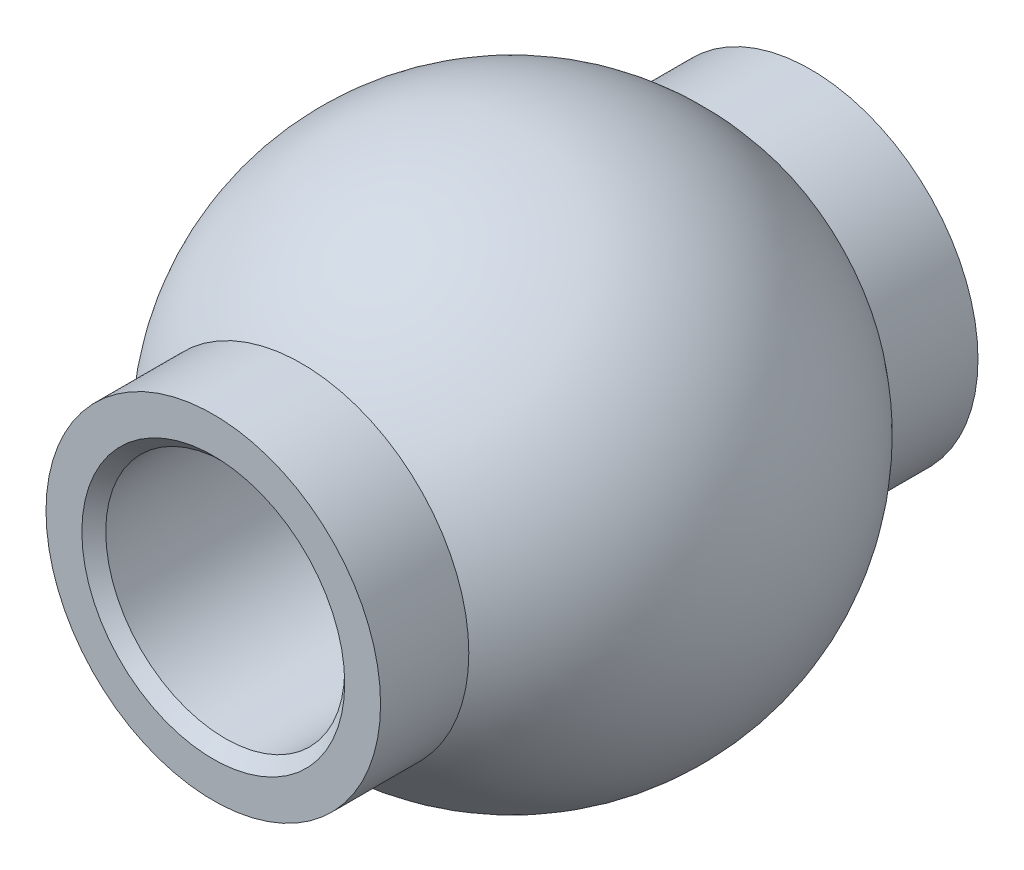
ISO-10303-21;
HEADER;
FILE_DESCRIPTION(('STEP AP214'),'2;1');
FILE_NAME('part.step','',(''),(''),'','','');
FILE_SCHEMA(('AUTOMOTIVE_DESIGN { 1 0 10303 214 1 1 1 1 }'));
ENDSEC;
DATA;
#1=APPLICATION_CONTEXT('core data for automotive mechanical design processes');
#2=APPLICATION_PROTOCOL_DEFINITION('international standard','automotive_design',2000,#1);
#3=PRODUCT_CONTEXT('',#1,'mechanical');
#4=PRODUCT('Part','Part','',(#3));
#5=PRODUCT_RELATED_PRODUCT_CATEGORY('part','',(#4));
#6=PRODUCT_DEFINITION_FORMATION('','',#4);
#7=PRODUCT_DEFINITION_CONTEXT('part definition',#1,'design');
#8=PRODUCT_DEFINITION('design','',#6,#7);
#9=PRODUCT_DEFINITION_SHAPE('','',#8);
#10=(LENGTH_UNIT() NAMED_UNIT(*) SI_UNIT(.MILLI.,.METRE.));
#11=(NAMED_UNIT(*) PLANE_ANGLE_UNIT() SI_UNIT($,.RADIAN.));
#12=(NAMED_UNIT(*) SI_UNIT($,.STERADIAN.) SOLID_ANGLE_UNIT());
#13=UNCERTAINTY_MEASURE_WITH_UNIT(LENGTH_MEASURE(1.E-05),#10,'distance_accuracy_value','');
#14=(GEOMETRIC_REPRESENTATION_CONTEXT(3) GLOBAL_UNCERTAINTY_ASSIGNED_CONTEXT((#13)) GLOBAL_UNIT_ASSIGNED_CONTEXT((#10,
#11,#12)) REPRESENTATION_CONTEXT('',''));
#15=CARTESIAN_POINT('',(0.,0.,0.));
#16=DIRECTION('',(0.,0.,1.));
#17=DIRECTION('',(1.,0.,0.));
#18=AXIS2_PLACEMENT_3D('',#15,#16,#17);
#19=CARTESIAN_POINT('',(0.,25.4,0.));
#20=DIRECTION('',(0.,-1.,0.));
#21=DIRECTION('',(-1.,0.,0.));
#22=AXIS2_PLACEMENT_3D('',#19,#20,#21);
#23=SPHERICAL_SURFACE('',#22,14.2875);
#24=CARTESIAN_POINT('',(0.,25.4,0.));
#25=DIRECTION('',(0.,0.,-1.));
#26=DIRECTION('',(-1.,0.,0.));
#27=AXIS2_PLACEMENT_3D('',#24,#25,#26);
#28=SPHERICAL_SURFACE('',#27,14.2875);
#29=CARTESIAN_POINT('',(0.,25.4,11.1848359956684));
#30=DIRECTION('',(0.,0.,-1.));
#31=DIRECTION('',(-1.,0.,0.));
#32=AXIS2_PLACEMENT_3D('',#29,#30,#31);
#33=CIRCLE('',#32,8.89);
#34=CARTESIAN_POINT('',(-8.89000000000001,25.4,11.1848359956684));
#35=VERTEX_POINT('',#34);
#36=EDGE_CURVE('E55',#35,#35,#33,.T.);
#37=ORIENTED_EDGE('',*,*,#36,.T.);
#38=EDGE_LOOP('',(#37));
#39=FACE_BOUND('',#38,.T.);
#40=CARTESIAN_POINT('',(0.,25.4,-11.1848359956684));
#41=DIRECTION('',(0.,0.,1.));
#42=DIRECTION('',(1.,0.,0.));
#43=AXIS2_PLACEMENT_3D('',#40,#41,#42);
#44=CIRCLE('',#43,8.89);
#45=CARTESIAN_POINT('',(8.88999999999999,25.4,-11.1848359956684));
#46=VERTEX_POINT('',#45);
#47=EDGE_CURVE('E52',#46,#46,#44,.T.);
#48=ORIENTED_EDGE('',*,*,#47,.T.);
#49=EDGE_LOOP('',(#48));
#50=FACE_BOUND('',#49,.T.);
#51=ADVANCED_FACE('F32',(#39,#50),#28,.T.);
#52=CARTESIAN_POINT('',(0.,25.4,15.875));
#53=DIRECTION('',(0.,0.,-1.));
#54=DIRECTION('',(-1.,0.,0.));
#55=AXIS2_PLACEMENT_3D('',#52,#53,#54);
#56=CYLINDRICAL_SURFACE('',#55,8.89);
#57=ORIENTED_EDGE('',*,*,#36,.F.);
#58=EDGE_LOOP('',(#57));
#59=FACE_BOUND('',#58,.T.);
#60=CARTESIAN_POINT('',(0.,25.4,15.875));
#61=DIRECTION('',(0.,0.,1.));
#62=DIRECTION('',(1.,0.,0.));
#63=AXIS2_PLACEMENT_3D('',#60,#61,#62);
#64=CIRCLE('',#63,8.89);
#65=CARTESIAN_POINT('',(8.88999999999999,25.4,15.875));
#66=VERTEX_POINT('',#65);
#67=EDGE_CURVE('E58',#66,#66,#64,.T.);
#68=ORIENTED_EDGE('',*,*,#67,.F.);
#69=EDGE_LOOP('',(#68));
#70=FACE_BOUND('',#69,.T.);
#71=ADVANCED_FACE('F67',(#59,#70),#56,.T.);
#72=CARTESIAN_POINT('',(0.,25.4,15.875));
#73=DIRECTION('',(0.,0.,1.));
#74=DIRECTION('',(1.,0.,0.));
#75=AXIS2_PLACEMENT_3D('',#72,#73,#74);
#76=PLANE('',#75);
#77=CARTESIAN_POINT('',(0.,25.4,15.875));
#78=DIRECTION('',(0.,0.,1.));
#79=DIRECTION('',(1.,0.,0.));
#80=AXIS2_PLACEMENT_3D('',#77,#78,#79);
#81=CIRCLE('',#80,6.98500000000003);
#82=CARTESIAN_POINT('',(6.98500000000002,25.4,15.875));
#83=VERTEX_POINT('',#82);
#84=EDGE_CURVE('E10',#83,#83,#81,.F.);
#85=ORIENTED_EDGE('',*,*,#84,.T.);
#86=EDGE_LOOP('',(#85));
#87=FACE_BOUND('',#86,.T.);
#88=ORIENTED_EDGE('',*,*,#67,.T.);
#89=EDGE_LOOP('',(#88));
#90=FACE_BOUND('',#89,.T.);
#91=ADVANCED_FACE('F65',(#87,#90),#76,.T.);
#92=ORIENTED_EDGE('',*,*,#47,.F.);
#93=EDGE_LOOP('',(#92));
#94=FACE_BOUND('',#93,.T.);
#95=CARTESIAN_POINT('',(0.,25.4,-15.875));
#96=DIRECTION('',(0.,0.,1.));
#97=DIRECTION('',(1.,0.,0.));
#98=AXIS2_PLACEMENT_3D('',#95,#96,#97);
#99=CIRCLE('',#98,8.89);
#100=CARTESIAN_POINT('',(8.88999999999999,25.4,-15.875));
#101=VERTEX_POINT('',#100);
#102=EDGE_CURVE('E59',#101,#101,#99,.T.);
#103=ORIENTED_EDGE('',*,*,#102,.T.);
#104=EDGE_LOOP('',(#103));
#105=FACE_BOUND('',#104,.T.);
#106=ADVANCED_FACE('F71',(#94,#105),#56,.T.);
#107=CARTESIAN_POINT('',(0.,25.4,-15.875));
#108=DIRECTION('',(0.,0.,1.));
#109=DIRECTION('',(1.,0.,0.));
#110=AXIS2_PLACEMENT_3D('',#107,#108,#109);
#111=PLANE('',#110);
#112=CARTESIAN_POINT('',(0.,25.4,-15.875));
#113=DIRECTION('',(0.,0.,1.));
#114=DIRECTION('',(1.,0.,0.));
#115=AXIS2_PLACEMENT_3D('',#112,#113,#114);
#116=CIRCLE('',#115,6.98499999999999);
#117=CARTESIAN_POINT('',(6.98499999999998,25.4,-15.875));
#118=VERTEX_POINT('',#117);
#119=EDGE_CURVE('E47',#118,#118,#116,.T.);
#120=ORIENTED_EDGE('',*,*,#119,.T.);
#121=EDGE_LOOP('',(#120));
#122=FACE_BOUND('',#121,.T.);
#123=ORIENTED_EDGE('',*,*,#102,.F.);
#124=EDGE_LOOP('',(#123));
#125=FACE_BOUND('',#124,.T.);
#126=ADVANCED_FACE('F83',(#122,#125),#111,.F.);
#127=CARTESIAN_POINT('',(0.,25.4,-14.2875));
#128=DIRECTION('',(0.,0.,1.));
#129=DIRECTION('',(1.,0.,0.));
#130=AXIS2_PLACEMENT_3D('',#127,#128,#129);
#131=CYLINDRICAL_SURFACE('',#130,6.35);
#132=CARTESIAN_POINT('',(0.,25.4,-15.24));
#133=DIRECTION('',(0.,0.,1.));
#134=DIRECTION('',(1.,0.,0.));
#135=AXIS2_PLACEMENT_3D('',#132,#133,#134);
#136=CIRCLE('',#135,6.35);
#137=CARTESIAN_POINT('',(6.34999999999999,25.4,-15.24));
#138=VERTEX_POINT('',#137);
#139=EDGE_CURVE('E39',#138,#138,#136,.F.);
#140=CARTESIAN_POINT('',(0.,25.4,15.24));
#141=DIRECTION('',(0.,0.,1.));
#142=DIRECTION('',(1.,0.,0.));
#143=AXIS2_PLACEMENT_3D('',#140,#141,#142);
#144=CIRCLE('',#143,6.35);
#145=CARTESIAN_POINT('',(6.34999999999999,25.4,15.24));
#146=VERTEX_POINT('',#145);
#147=EDGE_CURVE('E43',#146,#146,#144,.T.);
#148=CARTESIAN_POINT('',(6.34999999999999,25.4,-15.24));
#149=CARTESIAN_POINT('',(6.34999999999999,25.4,-14.9225));
#150=CARTESIAN_POINT('',(6.34999999999999,25.4,-14.605));
#151=CARTESIAN_POINT('',(6.34999999999999,25.4,-13.97));
#152=CARTESIAN_POINT('',(6.34999999999999,25.4,-13.6525));
#153=CARTESIAN_POINT('',(6.34999999999999,25.4,-13.0175));
#154=CARTESIAN_POINT('',(6.34999999999999,25.4,-12.7));
#155=CARTESIAN_POINT('',(6.34999999999999,25.4,-12.065));
#156=CARTESIAN_POINT('',(6.34999999999999,25.4,-11.7475));
#157=CARTESIAN_POINT('',(6.34999999999999,25.4,-11.1125));
#158=CARTESIAN_POINT('',(6.34999999999999,25.4,-10.795));
#159=CARTESIAN_POINT('',(6.34999999999999,25.4,-10.16));
#160=CARTESIAN_POINT('',(6.34999999999999,25.4,-9.84250000000002));
#161=CARTESIAN_POINT('',(6.34999999999999,25.4,-9.20750000000002));
#162=CARTESIAN_POINT('',(6.34999999999999,25.4,-8.89000000000002));
#163=CARTESIAN_POINT('',(6.34999999999999,25.4,-8.25500000000002));
#164=CARTESIAN_POINT('',(6.34999999999999,25.4,-7.93750000000002));
#165=CARTESIAN_POINT('',(6.34999999999999,25.4,-7.30250000000002));
#166=CARTESIAN_POINT('',(6.34999999999999,25.4,-6.98500000000002));
#167=CARTESIAN_POINT('',(6.34999999999999,25.4,-6.35000000000002));
#168=CARTESIAN_POINT('',(6.34999999999999,25.4,-6.03250000000002));
#169=CARTESIAN_POINT('',(6.34999999999999,25.4,-5.39750000000002));
#170=CARTESIAN_POINT('',(6.34999999999999,25.4,-5.08000000000002));
#171=CARTESIAN_POINT('',(6.34999999999999,25.4,-4.44500000000002));
#172=CARTESIAN_POINT('',(6.34999999999999,25.4,-4.12750000000002));
#173=CARTESIAN_POINT('',(6.34999999999999,25.4,-3.49250000000002));
#174=CARTESIAN_POINT('',(6.34999999999999,25.4,-3.17500000000002));
#175=CARTESIAN_POINT('',(6.34999999999999,25.4,-2.54000000000002));
#176=CARTESIAN_POINT('',(6.34999999999999,25.4,-2.22250000000002));
#177=CARTESIAN_POINT('',(6.34999999999999,25.4,-1.58750000000002));
#178=CARTESIAN_POINT('',(6.34999999999999,25.4,-1.27000000000002));
#179=CARTESIAN_POINT('',(6.34999999999999,25.4,-0.635000000000023));
#180=CARTESIAN_POINT('',(6.34999999999999,25.4,-0.317500000000024));
#181=CARTESIAN_POINT('',(6.34999999999999,25.4,0.317499999999975));
#182=CARTESIAN_POINT('',(6.34999999999999,25.4,0.634999999999975));
#183=CARTESIAN_POINT('',(6.34999999999999,25.4,1.26999999999997));
#184=CARTESIAN_POINT('',(6.34999999999999,25.4,1.58749999999997));
#185=CARTESIAN_POINT('',(6.34999999999999,25.4,2.22249999999997));
#186=CARTESIAN_POINT('',(6.34999999999999,25.4,2.53999999999997));
#187=CARTESIAN_POINT('',(6.34999999999999,25.4,3.17499999999997));
#188=CARTESIAN_POINT('',(6.34999999999999,25.4,3.49249999999997));
#189=CARTESIAN_POINT('',(6.34999999999999,25.4,4.12749999999997));
#190=CARTESIAN_POINT('',(6.34999999999999,25.4,4.44499999999997));
#191=CARTESIAN_POINT('',(6.34999999999999,25.4,5.07999999999997));
#192=CARTESIAN_POINT('',(6.34999999999999,25.4,5.39749999999997));
#193=CARTESIAN_POINT('',(6.34999999999999,25.4,6.03249999999997));
#194=CARTESIAN_POINT('',(6.34999999999999,25.4,6.34999999999997));
#195=CARTESIAN_POINT('',(6.34999999999999,25.4,6.98499999999997));
#196=CARTESIAN_POINT('',(6.34999999999999,25.4,7.30249999999997));
#197=CARTESIAN_POINT('',(6.34999999999999,25.4,7.93749999999997));
#198=CARTESIAN_POINT('',(6.34999999999999,25.4,8.25499999999997));
#199=CARTESIAN_POINT('',(6.34999999999999,25.4,8.88999999999997));
#200=CARTESIAN_POINT('',(6.34999999999999,25.4,9.20749999999997));
#201=CARTESIAN_POINT('',(6.34999999999999,25.4,9.84249999999997));
#202=CARTESIAN_POINT('',(6.34999999999999,25.4,10.16));
#203=CARTESIAN_POINT('',(6.34999999999999,25.4,10.795));
#204=CARTESIAN_POINT('',(6.34999999999999,25.4,11.1125));
#205=CARTESIAN_POINT('',(6.34999999999999,25.4,11.7475));
#206=CARTESIAN_POINT('',(6.34999999999999,25.4,12.065));
#207=CARTESIAN_POINT('',(6.34999999999999,25.4,12.7));
#208=CARTESIAN_POINT('',(6.34999999999999,25.4,13.0175));
#209=CARTESIAN_POINT('',(6.34999999999999,25.4,13.6525));
#210=CARTESIAN_POINT('',(6.34999999999999,25.4,13.97));
#211=CARTESIAN_POINT('',(6.34999999999999,25.4,14.605));
#212=CARTESIAN_POINT('',(6.34999999999999,25.4,14.9225));
#213=CARTESIAN_POINT('',(6.34999999999999,25.4,15.24));
#214=B_SPLINE_CURVE_WITH_KNOTS('',3,(#148,#149,#150,#151,#152,#153,#154,#155,#156,#157,#158,
#159,#160,#161,#162,#163,#164,#165,#166,#167,#168,#169,#170,#171,#172,#173,#174,#175,#176,#177,
#178,#179,#180,#181,#182,#183,#184,#185,#186,#187,#188,#189,#190,#191,#192,#193,#194,#195,#196,
#197,#198,#199,#200,#201,#202,#203,#204,#205,#206,#207,#208,#209,#210,#211,#212,#213),
.UNSPECIFIED.,.F.,.F.,(4,2,2,2,2,2,2,2,2,2,2,2,2,2,2,2,2,2,2,2,2,2,2,2,2,2,2,2,2,2,2,2,4),(0.,
0.9525,1.905,2.8575,3.81,4.7625,5.715,6.66749999999999,7.61999999999999,8.57249999999999,
9.52499999999999,10.4775,11.43,12.3825,13.335,14.2875,15.24,16.1925,17.145,18.0975,19.05,
20.0025,20.955,21.9075,22.86,23.8125,24.765,25.7175,26.67,27.6225,28.575,29.5275,30.48),.UNSPECIFIED.);
#215=EDGE_CURVE('BSEAM88',#138,#146,#214,.T.);
#216=ORIENTED_EDGE('',*,*,#139,.T.);
#217=ORIENTED_EDGE('',*,*,#147,.T.);
#218=ORIENTED_EDGE('',*,*,#215,.T.);
#219=ORIENTED_EDGE('',*,*,#215,.F.);
#220=EDGE_LOOP('',(#216,#218,#217,#219));
#221=FACE_BOUND('',#220,.T.);
#222=ADVANCED_FACE('F88',(#221),#131,.F.);
#223=CARTESIAN_POINT('',(0.,25.4,-15.875));
#224=DIRECTION('',(0.,0.,-1.));
#225=DIRECTION('',(-1.,0.,0.));
#226=AXIS2_PLACEMENT_3D('',#223,#224,#225);
#227=CONICAL_SURFACE('',#226,6.98499999999999,0.785398163397446);
#228=ORIENTED_EDGE('',*,*,#139,.F.);
#229=EDGE_LOOP('',(#228));
#230=FACE_BOUND('',#229,.T.);
#231=ORIENTED_EDGE('',*,*,#119,.F.);
#232=EDGE_LOOP('',(#231));
#233=FACE_BOUND('',#232,.T.);
#234=ADVANCED_FACE('F98',(#230,#233),#227,.F.);
#235=CARTESIAN_POINT('',(0.,25.4,15.24));
#236=DIRECTION('',(0.,0.,1.));
#237=DIRECTION('',(1.,0.,0.));
#238=AXIS2_PLACEMENT_3D('',#235,#236,#237);
#239=CONICAL_SURFACE('',#238,6.35,0.785398163397448);
#240=ORIENTED_EDGE('',*,*,#84,.F.);
#241=EDGE_LOOP('',(#240));
#242=FACE_BOUND('',#241,.T.);
#243=ORIENTED_EDGE('',*,*,#147,.F.);
#244=EDGE_LOOP('',(#243));
#245=FACE_BOUND('',#244,.T.);
#246=ADVANCED_FACE('F34',(#242,#245),#239,.F.);
#247=CLOSED_SHELL('',(#51,#71,#91,#106,#126,#222,#234,#246));
#248=MANIFOLD_SOLID_BREP('B2',#247);
#249=ADVANCED_BREP_SHAPE_REPRESENTATION('',(#18,#248),#14);
#250=SHAPE_DEFINITION_REPRESENTATION(#9,#249);
ENDSEC;
END-ISO-10303-21;
